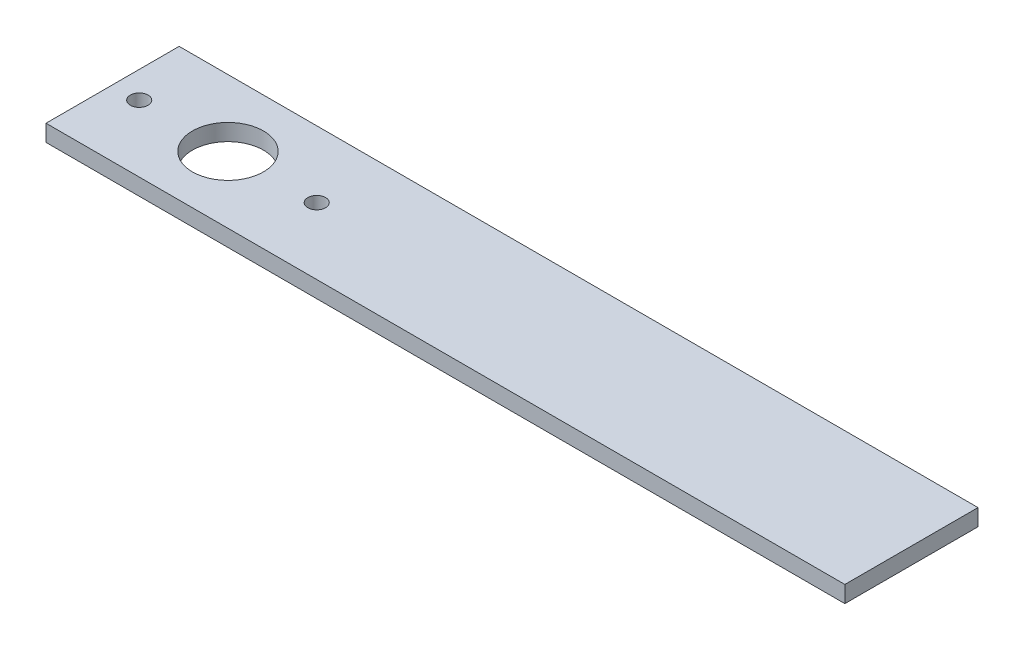
ISO-10303-21;
HEADER;
FILE_DESCRIPTION(('STEP AP214'),'2;1');
FILE_NAME('part.step','',(''),(''),'','','');
FILE_SCHEMA(('AUTOMOTIVE_DESIGN { 1 0 10303 214 1 1 1 1 }'));
ENDSEC;
DATA;
#1=APPLICATION_CONTEXT('core data for automotive mechanical design processes');
#2=APPLICATION_PROTOCOL_DEFINITION('international standard','automotive_design',2000,#1);
#3=PRODUCT_CONTEXT('',#1,'mechanical');
#4=PRODUCT('Part','Part','',(#3));
#5=PRODUCT_RELATED_PRODUCT_CATEGORY('part','',(#4));
#6=PRODUCT_DEFINITION_FORMATION('','',#4);
#7=PRODUCT_DEFINITION_CONTEXT('part definition',#1,'design');
#8=PRODUCT_DEFINITION('design','',#6,#7);
#9=PRODUCT_DEFINITION_SHAPE('','',#8);
#10=(LENGTH_UNIT() NAMED_UNIT(*) SI_UNIT(.MILLI.,.METRE.));
#11=(NAMED_UNIT(*) PLANE_ANGLE_UNIT() SI_UNIT($,.RADIAN.));
#12=(NAMED_UNIT(*) SI_UNIT($,.STERADIAN.) SOLID_ANGLE_UNIT());
#13=UNCERTAINTY_MEASURE_WITH_UNIT(LENGTH_MEASURE(1.E-05),#10,'distance_accuracy_value','');
#14=(GEOMETRIC_REPRESENTATION_CONTEXT(3) GLOBAL_UNCERTAINTY_ASSIGNED_CONTEXT((#13)) GLOBAL_UNIT_ASSIGNED_CONTEXT((#10,
#11,#12)) REPRESENTATION_CONTEXT('',''));
#15=CARTESIAN_POINT('',(0.,0.,0.));
#16=DIRECTION('',(0.,0.,1.));
#17=DIRECTION('',(1.,0.,0.));
#18=AXIS2_PLACEMENT_3D('',#15,#16,#17);
#19=CARTESIAN_POINT('',(-228.6,-4.7625,19.0500000000001));
#20=DIRECTION('',(-1.,0.,0.));
#21=DIRECTION('',(0.,0.,1.));
#22=AXIS2_PLACEMENT_3D('',#19,#20,#21);
#23=PLANE('',#22);
#24=DIRECTION('',(0.,0.,1.));
#25=VECTOR('',#24,1.);
#26=CARTESIAN_POINT('',(-228.6,0.,19.0500000000001));
#27=LINE('',#26,#25);
#28=CARTESIAN_POINT('',(-228.6,0.,-19.05));
#29=VERTEX_POINT('',#28);
#30=CARTESIAN_POINT('',(-228.6,0.,19.0500000000001));
#31=VERTEX_POINT('',#30);
#32=EDGE_CURVE('E108',#29,#31,#27,.T.);
#33=ORIENTED_EDGE('',*,*,#32,.F.);
#34=DIRECTION('',(0.,1.,0.));
#35=VECTOR('',#34,1.);
#36=CARTESIAN_POINT('',(-228.6,-4.7625,-19.05));
#37=LINE('',#36,#35);
#38=CARTESIAN_POINT('',(-228.6,-4.7625,-19.05));
#39=VERTEX_POINT('',#38);
#40=EDGE_CURVE('E11',#39,#29,#37,.T.);
#41=ORIENTED_EDGE('',*,*,#40,.F.);
#42=DIRECTION('',(0.,0.,1.));
#43=VECTOR('',#42,1.);
#44=CARTESIAN_POINT('',(-228.6,-4.7625,19.0500000000001));
#45=LINE('',#44,#43);
#46=CARTESIAN_POINT('',(-228.6,-4.7625,19.0500000000001));
#47=VERTEX_POINT('',#46);
#48=EDGE_CURVE('E101',#39,#47,#45,.T.);
#49=ORIENTED_EDGE('',*,*,#48,.T.);
#50=DIRECTION('',(0.,1.,0.));
#51=VECTOR('',#50,1.);
#52=CARTESIAN_POINT('',(-228.6,-4.7625,19.0500000000001));
#53=LINE('',#52,#51);
#54=EDGE_CURVE('E46',#47,#31,#53,.T.);
#55=ORIENTED_EDGE('',*,*,#54,.T.);
#56=EDGE_LOOP('',(#33,#41,#49,#55));
#57=FACE_BOUND('',#56,.T.);
#58=ADVANCED_FACE('F43',(#57),#23,.T.);
#59=CARTESIAN_POINT('',(-228.6,-4.7625,-19.05));
#60=DIRECTION('',(0.,0.,-1.));
#61=DIRECTION('',(-1.,0.,0.));
#62=AXIS2_PLACEMENT_3D('',#59,#60,#61);
#63=PLANE('',#62);
#64=DIRECTION('',(-1.,0.,0.));
#65=VECTOR('',#64,1.);
#66=CARTESIAN_POINT('',(-228.6,0.,-19.05));
#67=LINE('',#66,#65);
#68=CARTESIAN_POINT('',(0.,0.,-19.05));
#69=VERTEX_POINT('',#68);
#70=EDGE_CURVE('E103',#69,#29,#67,.T.);
#71=ORIENTED_EDGE('',*,*,#70,.F.);
#72=DIRECTION('',(0.,1.,0.));
#73=VECTOR('',#72,1.);
#74=CARTESIAN_POINT('',(0.,-4.7625,-19.05));
#75=LINE('',#74,#73);
#76=CARTESIAN_POINT('',(0.,-4.7625,-19.05));
#77=VERTEX_POINT('',#76);
#78=EDGE_CURVE('E52',#77,#69,#75,.T.);
#79=ORIENTED_EDGE('',*,*,#78,.F.);
#80=DIRECTION('',(-1.,0.,0.));
#81=VECTOR('',#80,1.);
#82=CARTESIAN_POINT('',(-228.6,-4.7625,-19.05));
#83=LINE('',#82,#81);
#84=EDGE_CURVE('E98',#77,#39,#83,.T.);
#85=ORIENTED_EDGE('',*,*,#84,.T.);
#86=ORIENTED_EDGE('',*,*,#40,.T.);
#87=EDGE_LOOP('',(#71,#79,#85,#86));
#88=FACE_BOUND('',#87,.T.);
#89=ADVANCED_FACE('F119',(#88),#63,.T.);
#90=CARTESIAN_POINT('',(0.,-4.7625,-19.05));
#91=DIRECTION('',(1.,0.,0.));
#92=DIRECTION('',(0.,0.,-1.));
#93=AXIS2_PLACEMENT_3D('',#90,#91,#92);
#94=PLANE('',#93);
#95=DIRECTION('',(0.,0.,-1.));
#96=VECTOR('',#95,1.);
#97=CARTESIAN_POINT('',(0.,0.,-19.05));
#98=LINE('',#97,#96);
#99=CARTESIAN_POINT('',(0.,0.,19.05));
#100=VERTEX_POINT('',#99);
#101=EDGE_CURVE('E93',#100,#69,#98,.T.);
#102=ORIENTED_EDGE('',*,*,#101,.F.);
#103=DIRECTION('',(0.,1.,0.));
#104=VECTOR('',#103,1.);
#105=CARTESIAN_POINT('',(0.,-4.7625,19.05));
#106=LINE('',#105,#104);
#107=CARTESIAN_POINT('',(0.,-4.7625,19.05));
#108=VERTEX_POINT('',#107);
#109=EDGE_CURVE('E88',#108,#100,#106,.T.);
#110=ORIENTED_EDGE('',*,*,#109,.F.);
#111=DIRECTION('',(0.,0.,-1.));
#112=VECTOR('',#111,1.);
#113=CARTESIAN_POINT('',(0.,-4.7625,-19.05));
#114=LINE('',#113,#112);
#115=EDGE_CURVE('E91',#108,#77,#114,.T.);
#116=ORIENTED_EDGE('',*,*,#115,.T.);
#117=ORIENTED_EDGE('',*,*,#78,.T.);
#118=EDGE_LOOP('',(#102,#110,#116,#117));
#119=FACE_BOUND('',#118,.T.);
#120=ADVANCED_FACE('F90',(#119),#94,.T.);
#121=CARTESIAN_POINT('',(-228.6,-4.7625,19.0500000000001));
#122=DIRECTION('',(0.,0.,1.));
#123=DIRECTION('',(1.,0.,0.));
#124=AXIS2_PLACEMENT_3D('',#121,#122,#123);
#125=PLANE('',#124);
#126=DIRECTION('',(1.,0.,0.));
#127=VECTOR('',#126,1.);
#128=CARTESIAN_POINT('',(-228.6,0.,19.0500000000001));
#129=LINE('',#128,#127);
#130=EDGE_CURVE('E111',#31,#100,#129,.T.);
#131=ORIENTED_EDGE('',*,*,#130,.F.);
#132=ORIENTED_EDGE('',*,*,#54,.F.);
#133=DIRECTION('',(1.,0.,0.));
#134=VECTOR('',#133,1.);
#135=CARTESIAN_POINT('',(-228.6,-4.7625,19.0500000000001));
#136=LINE('',#135,#134);
#137=EDGE_CURVE('E97',#47,#108,#136,.T.);
#138=ORIENTED_EDGE('',*,*,#137,.T.);
#139=ORIENTED_EDGE('',*,*,#109,.T.);
#140=EDGE_LOOP('',(#131,#132,#138,#139));
#141=FACE_BOUND('',#140,.T.);
#142=ADVANCED_FACE('F100',(#141),#125,.T.);
#143=CARTESIAN_POINT('',(0.,-4.7625,0.));
#144=DIRECTION('',(0.,-1.,0.));
#145=DIRECTION('',(0.,0.,-1.));
#146=AXIS2_PLACEMENT_3D('',#143,#144,#145);
#147=PLANE('',#146);
#148=CARTESIAN_POINT('',(-170.18,-4.7625,0.));
#149=DIRECTION('',(0.,1.,0.));
#150=DIRECTION('',(0.,0.,1.));
#151=AXIS2_PLACEMENT_3D('',#148,#149,#150);
#152=CIRCLE('',#151,2.53999999999998);
#153=CARTESIAN_POINT('',(-170.18,-4.7625,2.53999999999998));
#154=VERTEX_POINT('',#153);
#155=EDGE_CURVE('E156',#154,#154,#152,.T.);
#156=ORIENTED_EDGE('',*,*,#155,.T.);
#157=EDGE_LOOP('',(#156));
#158=FACE_BOUND('',#157,.T.);
#159=CARTESIAN_POINT('',(-195.58,-4.7625,0.));
#160=DIRECTION('',(0.,1.,0.));
#161=DIRECTION('',(0.,0.,1.));
#162=AXIS2_PLACEMENT_3D('',#159,#160,#161);
#163=CIRCLE('',#162,10.16);
#164=CARTESIAN_POINT('',(-195.58,-4.7625,10.16));
#165=VERTEX_POINT('',#164);
#166=EDGE_CURVE('E164',#165,#165,#163,.T.);
#167=ORIENTED_EDGE('',*,*,#166,.T.);
#168=EDGE_LOOP('',(#167));
#169=FACE_BOUND('',#168,.T.);
#170=CARTESIAN_POINT('',(-220.98,-4.7625,0.));
#171=DIRECTION('',(0.,1.,0.));
#172=DIRECTION('',(0.,0.,1.));
#173=AXIS2_PLACEMENT_3D('',#170,#171,#172);
#174=CIRCLE('',#173,2.53999999999998);
#175=CARTESIAN_POINT('',(-220.98,-4.7625,2.53999999999998));
#176=VERTEX_POINT('',#175);
#177=EDGE_CURVE('E112',#176,#176,#174,.T.);
#178=ORIENTED_EDGE('',*,*,#177,.T.);
#179=EDGE_LOOP('',(#178));
#180=FACE_BOUND('',#179,.T.);
#181=ORIENTED_EDGE('',*,*,#48,.F.);
#182=ORIENTED_EDGE('',*,*,#84,.F.);
#183=ORIENTED_EDGE('',*,*,#115,.F.);
#184=ORIENTED_EDGE('',*,*,#137,.F.);
#185=EDGE_LOOP('',(#181,#182,#183,#184));
#186=FACE_BOUND('',#185,.T.);
#187=ADVANCED_FACE('F96',(#158,#169,#180,#186),#147,.T.);
#188=CARTESIAN_POINT('',(0.,0.,0.));
#189=DIRECTION('',(0.,-1.,0.));
#190=DIRECTION('',(0.,0.,-1.));
#191=AXIS2_PLACEMENT_3D('',#188,#189,#190);
#192=PLANE('',#191);
#193=CARTESIAN_POINT('',(-170.18,0.,0.));
#194=DIRECTION('',(0.,1.,0.));
#195=DIRECTION('',(0.,0.,1.));
#196=AXIS2_PLACEMENT_3D('',#193,#194,#195);
#197=CIRCLE('',#196,2.53999999999998);
#198=CARTESIAN_POINT('',(-170.18,0.,2.53999999999998));
#199=VERTEX_POINT('',#198);
#200=EDGE_CURVE('E159',#199,#199,#197,.T.);
#201=ORIENTED_EDGE('',*,*,#200,.F.);
#202=EDGE_LOOP('',(#201));
#203=FACE_BOUND('',#202,.T.);
#204=CARTESIAN_POINT('',(-195.58,0.,0.));
#205=DIRECTION('',(0.,1.,0.));
#206=DIRECTION('',(0.,0.,1.));
#207=AXIS2_PLACEMENT_3D('',#204,#205,#206);
#208=CIRCLE('',#207,10.16);
#209=CARTESIAN_POINT('',(-195.58,0.,10.16));
#210=VERTEX_POINT('',#209);
#211=EDGE_CURVE('E161',#210,#210,#208,.T.);
#212=ORIENTED_EDGE('',*,*,#211,.F.);
#213=EDGE_LOOP('',(#212));
#214=FACE_BOUND('',#213,.T.);
#215=CARTESIAN_POINT('',(-220.98,0.,0.));
#216=DIRECTION('',(0.,1.,0.));
#217=DIRECTION('',(0.,0.,1.));
#218=AXIS2_PLACEMENT_3D('',#215,#216,#217);
#219=CIRCLE('',#218,2.53999999999998);
#220=CARTESIAN_POINT('',(-220.98,0.,2.53999999999998));
#221=VERTEX_POINT('',#220);
#222=EDGE_CURVE('E167',#221,#221,#219,.T.);
#223=ORIENTED_EDGE('',*,*,#222,.F.);
#224=EDGE_LOOP('',(#223));
#225=FACE_BOUND('',#224,.T.);
#226=ORIENTED_EDGE('',*,*,#32,.T.);
#227=ORIENTED_EDGE('',*,*,#130,.T.);
#228=ORIENTED_EDGE('',*,*,#101,.T.);
#229=ORIENTED_EDGE('',*,*,#70,.T.);
#230=EDGE_LOOP('',(#226,#227,#228,#229));
#231=FACE_BOUND('',#230,.T.);
#232=ADVANCED_FACE('F118',(#203,#214,#225,#231),#192,.F.);
#233=CARTESIAN_POINT('',(-220.98,-4.7625,0.));
#234=DIRECTION('',(0.,1.,0.));
#235=DIRECTION('',(0.,0.,1.));
#236=AXIS2_PLACEMENT_3D('',#233,#234,#235);
#237=CYLINDRICAL_SURFACE('',#236,2.53999999999998);
#238=CARTESIAN_POINT('',(-220.98,-4.7625,2.53999999999998));
#239=CARTESIAN_POINT('',(-220.98,-4.712890625,2.53999999999998));
#240=CARTESIAN_POINT('',(-220.98,-4.66328125,2.53999999999998));
#241=CARTESIAN_POINT('',(-220.98,-4.5640625,2.53999999999998));
#242=CARTESIAN_POINT('',(-220.98,-4.514453125,2.53999999999998));
#243=CARTESIAN_POINT('',(-220.98,-4.415234375,2.53999999999998));
#244=CARTESIAN_POINT('',(-220.98,-4.365625,2.53999999999998));
#245=CARTESIAN_POINT('',(-220.98,-4.26640625,2.53999999999998));
#246=CARTESIAN_POINT('',(-220.98,-4.216796875,2.53999999999998));
#247=CARTESIAN_POINT('',(-220.98,-4.117578125,2.53999999999998));
#248=CARTESIAN_POINT('',(-220.98,-4.06796875,2.53999999999998));
#249=CARTESIAN_POINT('',(-220.98,-3.96875,2.53999999999998));
#250=CARTESIAN_POINT('',(-220.98,-3.919140625,2.53999999999998));
#251=CARTESIAN_POINT('',(-220.98,-3.819921875,2.53999999999998));
#252=CARTESIAN_POINT('',(-220.98,-3.7703125,2.53999999999998));
#253=CARTESIAN_POINT('',(-220.98,-3.67109375,2.53999999999998));
#254=CARTESIAN_POINT('',(-220.98,-3.621484375,2.53999999999998));
#255=CARTESIAN_POINT('',(-220.98,-3.522265625,2.53999999999998));
#256=CARTESIAN_POINT('',(-220.98,-3.47265625,2.53999999999998));
#257=CARTESIAN_POINT('',(-220.98,-3.3734375,2.53999999999998));
#258=CARTESIAN_POINT('',(-220.98,-3.323828125,2.53999999999998));
#259=CARTESIAN_POINT('',(-220.98,-3.224609375,2.53999999999998));
#260=CARTESIAN_POINT('',(-220.98,-3.175,2.53999999999998));
#261=CARTESIAN_POINT('',(-220.98,-3.07578125,2.53999999999998));
#262=CARTESIAN_POINT('',(-220.98,-3.026171875,2.53999999999998));
#263=CARTESIAN_POINT('',(-220.98,-2.926953125,2.53999999999998));
#264=CARTESIAN_POINT('',(-220.98,-2.87734375,2.53999999999998));
#265=CARTESIAN_POINT('',(-220.98,-2.778125,2.53999999999998));
#266=CARTESIAN_POINT('',(-220.98,-2.728515625,2.53999999999998));
#267=CARTESIAN_POINT('',(-220.98,-2.629296875,2.53999999999998));
#268=CARTESIAN_POINT('',(-220.98,-2.5796875,2.53999999999998));
#269=CARTESIAN_POINT('',(-220.98,-2.48046875,2.53999999999998));
#270=CARTESIAN_POINT('',(-220.98,-2.430859375,2.53999999999998));
#271=CARTESIAN_POINT('',(-220.98,-2.331640625,2.53999999999998));
#272=CARTESIAN_POINT('',(-220.98,-2.28203125,2.53999999999998));
#273=CARTESIAN_POINT('',(-220.98,-2.1828125,2.53999999999998));
#274=CARTESIAN_POINT('',(-220.98,-2.133203125,2.53999999999998));
#275=CARTESIAN_POINT('',(-220.98,-2.033984375,2.53999999999998));
#276=CARTESIAN_POINT('',(-220.98,-1.984375,2.53999999999998));
#277=CARTESIAN_POINT('',(-220.98,-1.88515625,2.53999999999998));
#278=CARTESIAN_POINT('',(-220.98,-1.835546875,2.53999999999998));
#279=CARTESIAN_POINT('',(-220.98,-1.736328125,2.53999999999998));
#280=CARTESIAN_POINT('',(-220.98,-1.68671875,2.53999999999998));
#281=CARTESIAN_POINT('',(-220.98,-1.5875,2.53999999999998));
#282=CARTESIAN_POINT('',(-220.98,-1.537890625,2.53999999999998));
#283=CARTESIAN_POINT('',(-220.98,-1.438671875,2.53999999999998));
#284=CARTESIAN_POINT('',(-220.98,-1.3890625,2.53999999999998));
#285=CARTESIAN_POINT('',(-220.98,-1.28984375,2.53999999999998));
#286=CARTESIAN_POINT('',(-220.98,-1.240234375,2.53999999999998));
#287=CARTESIAN_POINT('',(-220.98,-1.141015625,2.53999999999998));
#288=CARTESIAN_POINT('',(-220.98,-1.09140625,2.53999999999998));
#289=CARTESIAN_POINT('',(-220.98,-0.9921875,2.53999999999998));
#290=CARTESIAN_POINT('',(-220.98,-0.942578125,2.53999999999998));
#291=CARTESIAN_POINT('',(-220.98,-0.843359375,2.53999999999998));
#292=CARTESIAN_POINT('',(-220.98,-0.79375,2.53999999999998));
#293=CARTESIAN_POINT('',(-220.98,-0.69453125,2.53999999999998));
#294=CARTESIAN_POINT('',(-220.98,-0.644921875,2.53999999999998));
#295=CARTESIAN_POINT('',(-220.98,-0.545703125,2.53999999999998));
#296=CARTESIAN_POINT('',(-220.98,-0.49609375,2.53999999999998));
#297=CARTESIAN_POINT('',(-220.98,-0.396875,2.53999999999998));
#298=CARTESIAN_POINT('',(-220.98,-0.347265625,2.53999999999998));
#299=CARTESIAN_POINT('',(-220.98,-0.248046875,2.53999999999998));
#300=CARTESIAN_POINT('',(-220.98,-0.1984375,2.53999999999998));
#301=CARTESIAN_POINT('',(-220.98,-0.09921875,2.53999999999998));
#302=CARTESIAN_POINT('',(-220.98,-0.049609375,2.53999999999998));
#303=CARTESIAN_POINT('',(-220.98,0.,2.53999999999998));
#304=B_SPLINE_CURVE_WITH_KNOTS('',3,(#238,#239,#240,#241,#242,#243,#244,#245,#246,#247,#248,
#249,#250,#251,#252,#253,#254,#255,#256,#257,#258,#259,#260,#261,#262,#263,#264,#265,#266,#267,
#268,#269,#270,#271,#272,#273,#274,#275,#276,#277,#278,#279,#280,#281,#282,#283,#284,#285,#286,
#287,#288,#289,#290,#291,#292,#293,#294,#295,#296,#297,#298,#299,#300,#301,#302,#303),
.UNSPECIFIED.,.F.,.F.,(4,2,2,2,2,2,2,2,2,2,2,2,2,2,2,2,2,2,2,2,2,2,2,2,2,2,2,2,2,2,2,2,4),(0.,
0.148828124999999,0.297656249999999,0.446484374999999,0.595312499999999,0.744140625,0.89296875,
1.041796875,1.190625,1.339453125,1.48828125,1.637109375,1.7859375,1.934765625,2.08359375,
2.232421875,2.38125,2.530078125,2.67890625,2.827734375,2.9765625,3.125390625,3.27421875,
3.423046875,3.571875,3.720703125,3.86953125,4.018359375,4.1671875,4.316015625,4.46484375,
4.613671875,4.7625),.UNSPECIFIED.);
#305=EDGE_CURVE('BSEAM137',#176,#221,#304,.T.);
#306=ORIENTED_EDGE('',*,*,#177,.F.);
#307=ORIENTED_EDGE('',*,*,#222,.T.);
#308=ORIENTED_EDGE('',*,*,#305,.T.);
#309=ORIENTED_EDGE('',*,*,#305,.F.);
#310=EDGE_LOOP('',(#306,#308,#307,#309));
#311=FACE_BOUND('',#310,.T.);
#312=ADVANCED_FACE('F137',(#311),#237,.F.);
#313=CARTESIAN_POINT('',(-195.58,-4.7625,0.));
#314=DIRECTION('',(0.,1.,0.));
#315=DIRECTION('',(0.,0.,1.));
#316=AXIS2_PLACEMENT_3D('',#313,#314,#315);
#317=CYLINDRICAL_SURFACE('',#316,10.16);
#318=CARTESIAN_POINT('',(-195.58,-4.7625,10.16));
#319=CARTESIAN_POINT('',(-195.58,-4.712890625,10.16));
#320=CARTESIAN_POINT('',(-195.58,-4.66328125,10.16));
#321=CARTESIAN_POINT('',(-195.58,-4.5640625,10.16));
#322=CARTESIAN_POINT('',(-195.58,-4.514453125,10.16));
#323=CARTESIAN_POINT('',(-195.58,-4.415234375,10.16));
#324=CARTESIAN_POINT('',(-195.58,-4.365625,10.16));
#325=CARTESIAN_POINT('',(-195.58,-4.26640625,10.16));
#326=CARTESIAN_POINT('',(-195.58,-4.216796875,10.16));
#327=CARTESIAN_POINT('',(-195.58,-4.117578125,10.16));
#328=CARTESIAN_POINT('',(-195.58,-4.06796875,10.16));
#329=CARTESIAN_POINT('',(-195.58,-3.96875,10.16));
#330=CARTESIAN_POINT('',(-195.58,-3.919140625,10.16));
#331=CARTESIAN_POINT('',(-195.58,-3.819921875,10.16));
#332=CARTESIAN_POINT('',(-195.58,-3.7703125,10.16));
#333=CARTESIAN_POINT('',(-195.58,-3.67109375,10.16));
#334=CARTESIAN_POINT('',(-195.58,-3.621484375,10.16));
#335=CARTESIAN_POINT('',(-195.58,-3.522265625,10.16));
#336=CARTESIAN_POINT('',(-195.58,-3.47265625,10.16));
#337=CARTESIAN_POINT('',(-195.58,-3.3734375,10.16));
#338=CARTESIAN_POINT('',(-195.58,-3.323828125,10.16));
#339=CARTESIAN_POINT('',(-195.58,-3.224609375,10.16));
#340=CARTESIAN_POINT('',(-195.58,-3.175,10.16));
#341=CARTESIAN_POINT('',(-195.58,-3.07578125,10.16));
#342=CARTESIAN_POINT('',(-195.58,-3.026171875,10.16));
#343=CARTESIAN_POINT('',(-195.58,-2.926953125,10.16));
#344=CARTESIAN_POINT('',(-195.58,-2.87734375,10.16));
#345=CARTESIAN_POINT('',(-195.58,-2.778125,10.16));
#346=CARTESIAN_POINT('',(-195.58,-2.728515625,10.16));
#347=CARTESIAN_POINT('',(-195.58,-2.629296875,10.16));
#348=CARTESIAN_POINT('',(-195.58,-2.5796875,10.16));
#349=CARTESIAN_POINT('',(-195.58,-2.48046875,10.16));
#350=CARTESIAN_POINT('',(-195.58,-2.430859375,10.16));
#351=CARTESIAN_POINT('',(-195.58,-2.331640625,10.16));
#352=CARTESIAN_POINT('',(-195.58,-2.28203125,10.16));
#353=CARTESIAN_POINT('',(-195.58,-2.1828125,10.16));
#354=CARTESIAN_POINT('',(-195.58,-2.133203125,10.16));
#355=CARTESIAN_POINT('',(-195.58,-2.033984375,10.16));
#356=CARTESIAN_POINT('',(-195.58,-1.984375,10.16));
#357=CARTESIAN_POINT('',(-195.58,-1.88515625,10.16));
#358=CARTESIAN_POINT('',(-195.58,-1.835546875,10.16));
#359=CARTESIAN_POINT('',(-195.58,-1.736328125,10.16));
#360=CARTESIAN_POINT('',(-195.58,-1.68671875,10.16));
#361=CARTESIAN_POINT('',(-195.58,-1.5875,10.16));
#362=CARTESIAN_POINT('',(-195.58,-1.537890625,10.16));
#363=CARTESIAN_POINT('',(-195.58,-1.438671875,10.16));
#364=CARTESIAN_POINT('',(-195.58,-1.3890625,10.16));
#365=CARTESIAN_POINT('',(-195.58,-1.28984375,10.16));
#366=CARTESIAN_POINT('',(-195.58,-1.240234375,10.16));
#367=CARTESIAN_POINT('',(-195.58,-1.141015625,10.16));
#368=CARTESIAN_POINT('',(-195.58,-1.09140625,10.16));
#369=CARTESIAN_POINT('',(-195.58,-0.9921875,10.16));
#370=CARTESIAN_POINT('',(-195.58,-0.942578125,10.16));
#371=CARTESIAN_POINT('',(-195.58,-0.843359375,10.16));
#372=CARTESIAN_POINT('',(-195.58,-0.79375,10.16));
#373=CARTESIAN_POINT('',(-195.58,-0.69453125,10.16));
#374=CARTESIAN_POINT('',(-195.58,-0.644921875,10.16));
#375=CARTESIAN_POINT('',(-195.58,-0.545703125,10.16));
#376=CARTESIAN_POINT('',(-195.58,-0.49609375,10.16));
#377=CARTESIAN_POINT('',(-195.58,-0.396875,10.16));
#378=CARTESIAN_POINT('',(-195.58,-0.347265625,10.16));
#379=CARTESIAN_POINT('',(-195.58,-0.248046875,10.16));
#380=CARTESIAN_POINT('',(-195.58,-0.1984375,10.16));
#381=CARTESIAN_POINT('',(-195.58,-0.09921875,10.16));
#382=CARTESIAN_POINT('',(-195.58,-0.049609375,10.16));
#383=CARTESIAN_POINT('',(-195.58,0.,10.16));
#384=B_SPLINE_CURVE_WITH_KNOTS('',3,(#318,#319,#320,#321,#322,#323,#324,#325,#326,#327,#328,
#329,#330,#331,#332,#333,#334,#335,#336,#337,#338,#339,#340,#341,#342,#343,#344,#345,#346,#347,
#348,#349,#350,#351,#352,#353,#354,#355,#356,#357,#358,#359,#360,#361,#362,#363,#364,#365,#366,
#367,#368,#369,#370,#371,#372,#373,#374,#375,#376,#377,#378,#379,#380,#381,#382,#383),
.UNSPECIFIED.,.F.,.F.,(4,2,2,2,2,2,2,2,2,2,2,2,2,2,2,2,2,2,2,2,2,2,2,2,2,2,2,2,2,2,2,2,4),(0.,
0.148828124999999,0.297656249999999,0.446484374999999,0.595312499999999,0.744140625,0.89296875,
1.041796875,1.190625,1.339453125,1.48828125,1.637109375,1.7859375,1.934765625,2.08359375,
2.232421875,2.38125,2.530078125,2.67890625,2.827734375,2.9765625,3.125390625,3.27421875,
3.423046875,3.571875,3.720703125,3.86953125,4.018359375,4.1671875,4.316015625,4.46484375,
4.613671875,4.7625),.UNSPECIFIED.);
#385=EDGE_CURVE('BSEAM144',#165,#210,#384,.T.);
#386=ORIENTED_EDGE('',*,*,#166,.F.);
#387=ORIENTED_EDGE('',*,*,#211,.T.);
#388=ORIENTED_EDGE('',*,*,#385,.T.);
#389=ORIENTED_EDGE('',*,*,#385,.F.);
#390=EDGE_LOOP('',(#386,#388,#387,#389));
#391=FACE_BOUND('',#390,.T.);
#392=ADVANCED_FACE('F144',(#391),#317,.F.);
#393=CARTESIAN_POINT('',(-170.18,-4.7625,0.));
#394=DIRECTION('',(0.,1.,0.));
#395=DIRECTION('',(0.,0.,1.));
#396=AXIS2_PLACEMENT_3D('',#393,#394,#395);
#397=CYLINDRICAL_SURFACE('',#396,2.53999999999998);
#398=CARTESIAN_POINT('',(-170.18,-4.7625,2.53999999999998));
#399=CARTESIAN_POINT('',(-170.18,-4.712890625,2.53999999999998));
#400=CARTESIAN_POINT('',(-170.18,-4.66328125,2.53999999999998));
#401=CARTESIAN_POINT('',(-170.18,-4.5640625,2.53999999999998));
#402=CARTESIAN_POINT('',(-170.18,-4.514453125,2.53999999999998));
#403=CARTESIAN_POINT('',(-170.18,-4.415234375,2.53999999999998));
#404=CARTESIAN_POINT('',(-170.18,-4.365625,2.53999999999998));
#405=CARTESIAN_POINT('',(-170.18,-4.26640625,2.53999999999998));
#406=CARTESIAN_POINT('',(-170.18,-4.216796875,2.53999999999998));
#407=CARTESIAN_POINT('',(-170.18,-4.117578125,2.53999999999998));
#408=CARTESIAN_POINT('',(-170.18,-4.06796875,2.53999999999998));
#409=CARTESIAN_POINT('',(-170.18,-3.96875,2.53999999999998));
#410=CARTESIAN_POINT('',(-170.18,-3.919140625,2.53999999999998));
#411=CARTESIAN_POINT('',(-170.18,-3.819921875,2.53999999999998));
#412=CARTESIAN_POINT('',(-170.18,-3.7703125,2.53999999999998));
#413=CARTESIAN_POINT('',(-170.18,-3.67109375,2.53999999999998));
#414=CARTESIAN_POINT('',(-170.18,-3.621484375,2.53999999999998));
#415=CARTESIAN_POINT('',(-170.18,-3.522265625,2.53999999999998));
#416=CARTESIAN_POINT('',(-170.18,-3.47265625,2.53999999999998));
#417=CARTESIAN_POINT('',(-170.18,-3.3734375,2.53999999999998));
#418=CARTESIAN_POINT('',(-170.18,-3.323828125,2.53999999999998));
#419=CARTESIAN_POINT('',(-170.18,-3.224609375,2.53999999999998));
#420=CARTESIAN_POINT('',(-170.18,-3.175,2.53999999999998));
#421=CARTESIAN_POINT('',(-170.18,-3.07578125,2.53999999999998));
#422=CARTESIAN_POINT('',(-170.18,-3.026171875,2.53999999999998));
#423=CARTESIAN_POINT('',(-170.18,-2.926953125,2.53999999999998));
#424=CARTESIAN_POINT('',(-170.18,-2.87734375,2.53999999999998));
#425=CARTESIAN_POINT('',(-170.18,-2.778125,2.53999999999998));
#426=CARTESIAN_POINT('',(-170.18,-2.728515625,2.53999999999998));
#427=CARTESIAN_POINT('',(-170.18,-2.629296875,2.53999999999998));
#428=CARTESIAN_POINT('',(-170.18,-2.5796875,2.53999999999998));
#429=CARTESIAN_POINT('',(-170.18,-2.48046875,2.53999999999998));
#430=CARTESIAN_POINT('',(-170.18,-2.430859375,2.53999999999998));
#431=CARTESIAN_POINT('',(-170.18,-2.331640625,2.53999999999998));
#432=CARTESIAN_POINT('',(-170.18,-2.28203125,2.53999999999998));
#433=CARTESIAN_POINT('',(-170.18,-2.1828125,2.53999999999998));
#434=CARTESIAN_POINT('',(-170.18,-2.133203125,2.53999999999998));
#435=CARTESIAN_POINT('',(-170.18,-2.033984375,2.53999999999998));
#436=CARTESIAN_POINT('',(-170.18,-1.984375,2.53999999999998));
#437=CARTESIAN_POINT('',(-170.18,-1.88515625,2.53999999999998));
#438=CARTESIAN_POINT('',(-170.18,-1.835546875,2.53999999999998));
#439=CARTESIAN_POINT('',(-170.18,-1.736328125,2.53999999999998));
#440=CARTESIAN_POINT('',(-170.18,-1.68671875,2.53999999999998));
#441=CARTESIAN_POINT('',(-170.18,-1.5875,2.53999999999998));
#442=CARTESIAN_POINT('',(-170.18,-1.537890625,2.53999999999998));
#443=CARTESIAN_POINT('',(-170.18,-1.438671875,2.53999999999998));
#444=CARTESIAN_POINT('',(-170.18,-1.3890625,2.53999999999998));
#445=CARTESIAN_POINT('',(-170.18,-1.28984375,2.53999999999998));
#446=CARTESIAN_POINT('',(-170.18,-1.240234375,2.53999999999998));
#447=CARTESIAN_POINT('',(-170.18,-1.141015625,2.53999999999998));
#448=CARTESIAN_POINT('',(-170.18,-1.09140625,2.53999999999998));
#449=CARTESIAN_POINT('',(-170.18,-0.9921875,2.53999999999998));
#450=CARTESIAN_POINT('',(-170.18,-0.942578125,2.53999999999998));
#451=CARTESIAN_POINT('',(-170.18,-0.843359375,2.53999999999998));
#452=CARTESIAN_POINT('',(-170.18,-0.79375,2.53999999999998));
#453=CARTESIAN_POINT('',(-170.18,-0.69453125,2.53999999999998));
#454=CARTESIAN_POINT('',(-170.18,-0.644921875,2.53999999999998));
#455=CARTESIAN_POINT('',(-170.18,-0.545703125,2.53999999999998));
#456=CARTESIAN_POINT('',(-170.18,-0.49609375,2.53999999999998));
#457=CARTESIAN_POINT('',(-170.18,-0.396875,2.53999999999998));
#458=CARTESIAN_POINT('',(-170.18,-0.347265625,2.53999999999998));
#459=CARTESIAN_POINT('',(-170.18,-0.248046875,2.53999999999998));
#460=CARTESIAN_POINT('',(-170.18,-0.1984375,2.53999999999998));
#461=CARTESIAN_POINT('',(-170.18,-0.09921875,2.53999999999998));
#462=CARTESIAN_POINT('',(-170.18,-0.049609375,2.53999999999998));
#463=CARTESIAN_POINT('',(-170.18,0.,2.53999999999998));
#464=B_SPLINE_CURVE_WITH_KNOTS('',3,(#398,#399,#400,#401,#402,#403,#404,#405,#406,#407,#408,
#409,#410,#411,#412,#413,#414,#415,#416,#417,#418,#419,#420,#421,#422,#423,#424,#425,#426,#427,
#428,#429,#430,#431,#432,#433,#434,#435,#436,#437,#438,#439,#440,#441,#442,#443,#444,#445,#446,
#447,#448,#449,#450,#451,#452,#453,#454,#455,#456,#457,#458,#459,#460,#461,#462,#463),
.UNSPECIFIED.,.F.,.F.,(4,2,2,2,2,2,2,2,2,2,2,2,2,2,2,2,2,2,2,2,2,2,2,2,2,2,2,2,2,2,2,2,4),(0.,
0.148828124999999,0.297656249999999,0.446484374999999,0.595312499999999,0.744140625,0.89296875,
1.041796875,1.190625,1.339453125,1.48828125,1.637109375,1.7859375,1.934765625,2.08359375,
2.232421875,2.38125,2.530078125,2.67890625,2.827734375,2.9765625,3.125390625,3.27421875,
3.423046875,3.571875,3.720703125,3.86953125,4.018359375,4.1671875,4.316015625,4.46484375,
4.613671875,4.7625),.UNSPECIFIED.);
#465=EDGE_CURVE('BSEAM148',#154,#199,#464,.T.);
#466=ORIENTED_EDGE('',*,*,#155,.F.);
#467=ORIENTED_EDGE('',*,*,#200,.T.);
#468=ORIENTED_EDGE('',*,*,#465,.T.);
#469=ORIENTED_EDGE('',*,*,#465,.F.);
#470=EDGE_LOOP('',(#466,#468,#467,#469));
#471=FACE_BOUND('',#470,.T.);
#472=ADVANCED_FACE('F148',(#471),#397,.F.);
#473=CLOSED_SHELL('',(#58,#89,#120,#142,#187,#232,#312,#392,#472));
#474=MANIFOLD_SOLID_BREP('B2',#473);
#475=ADVANCED_BREP_SHAPE_REPRESENTATION('',(#18,#474),#14);
#476=SHAPE_DEFINITION_REPRESENTATION(#9,#475);
ENDSEC;
END-ISO-10303-21;
